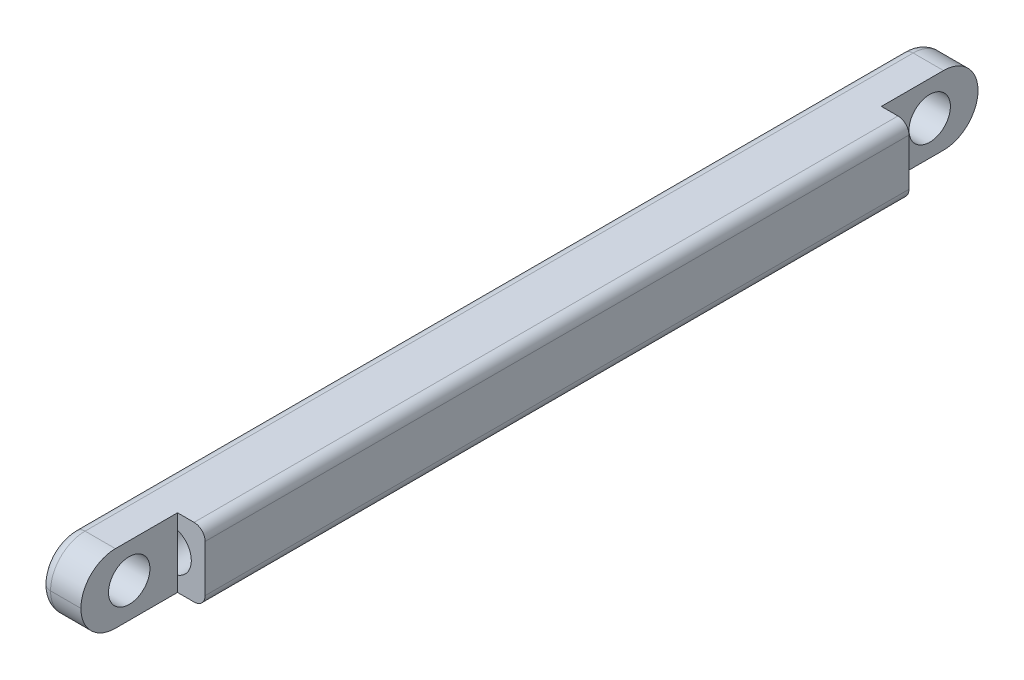
ISO-10303-21;
HEADER;
FILE_DESCRIPTION(('STEP AP214'),'2;1');
FILE_NAME('part.step','',(''),(''),'','','');
FILE_SCHEMA(('AUTOMOTIVE_DESIGN { 1 0 10303 214 1 1 1 1 }'));
ENDSEC;
DATA;
#1=APPLICATION_CONTEXT('core data for automotive mechanical design processes');
#2=APPLICATION_PROTOCOL_DEFINITION('international standard','automotive_design',2000,#1);
#3=PRODUCT_CONTEXT('',#1,'mechanical');
#4=PRODUCT('Part','Part','',(#3));
#5=PRODUCT_RELATED_PRODUCT_CATEGORY('part','',(#4));
#6=PRODUCT_DEFINITION_FORMATION('','',#4);
#7=PRODUCT_DEFINITION_CONTEXT('part definition',#1,'design');
#8=PRODUCT_DEFINITION('design','',#6,#7);
#9=PRODUCT_DEFINITION_SHAPE('','',#8);
#10=(LENGTH_UNIT() NAMED_UNIT(*) SI_UNIT(.MILLI.,.METRE.));
#11=(NAMED_UNIT(*) PLANE_ANGLE_UNIT() SI_UNIT($,.RADIAN.));
#12=(NAMED_UNIT(*) SI_UNIT($,.STERADIAN.) SOLID_ANGLE_UNIT());
#13=UNCERTAINTY_MEASURE_WITH_UNIT(LENGTH_MEASURE(1.E-05),#10,'distance_accuracy_value','');
#14=(GEOMETRIC_REPRESENTATION_CONTEXT(3) GLOBAL_UNCERTAINTY_ASSIGNED_CONTEXT((#13)) GLOBAL_UNIT_ASSIGNED_CONTEXT((#10,
#11,#12)) REPRESENTATION_CONTEXT('',''));
#15=CARTESIAN_POINT('',(0.,0.,0.));
#16=DIRECTION('',(0.,0.,1.));
#17=DIRECTION('',(1.,0.,0.));
#18=AXIS2_PLACEMENT_3D('',#15,#16,#17);
#19=CARTESIAN_POINT('',(0.,0.,0.));
#20=DIRECTION('',(0.,0.,1.));
#21=DIRECTION('',(1.,0.,0.));
#22=AXIS2_PLACEMENT_3D('',#19,#20,#21);
#23=PLANE('',#22);
#24=DIRECTION('',(0.,1.,0.));
#25=VECTOR('',#24,1.);
#26=CARTESIAN_POINT('',(2.5,2.5,0.));
#27=LINE('',#26,#25);
#28=CARTESIAN_POINT('',(2.5,-1.7,0.));
#29=VERTEX_POINT('',#28);
#30=CARTESIAN_POINT('',(2.5,1.7,0.));
#31=VERTEX_POINT('',#30);
#32=EDGE_CURVE('E259',#29,#31,#27,.T.);
#33=ORIENTED_EDGE('',*,*,#32,.F.);
#34=CARTESIAN_POINT('',(1.7,-1.7,0.));
#35=DIRECTION('',(0.,0.,1.));
#36=DIRECTION('',(1.,0.,0.));
#37=AXIS2_PLACEMENT_3D('',#34,#35,#36);
#38=CIRCLE('',#37,0.8);
#39=CARTESIAN_POINT('',(1.7,-2.5,0.));
#40=VERTEX_POINT('',#39);
#41=EDGE_CURVE('E177',#29,#40,#38,.F.);
#42=ORIENTED_EDGE('',*,*,#41,.T.);
#43=DIRECTION('',(1.,0.,0.));
#44=VECTOR('',#43,1.);
#45=CARTESIAN_POINT('',(-2.5,-2.5,0.));
#46=LINE('',#45,#44);
#47=CARTESIAN_POINT('',(0.5,-2.5,0.));
#48=VERTEX_POINT('',#47);
#49=EDGE_CURVE('E162',#48,#40,#46,.T.);
#50=ORIENTED_EDGE('',*,*,#49,.F.);
#51=DIRECTION('',(0.,-1.,0.));
#52=VECTOR('',#51,1.);
#53=CARTESIAN_POINT('',(0.5,2.5,0.));
#54=LINE('',#53,#52);
#55=CARTESIAN_POINT('',(0.5,-1.4142135623731,0.));
#56=VERTEX_POINT('',#55);
#57=EDGE_CURVE('E175',#56,#48,#54,.T.);
#58=ORIENTED_EDGE('',*,*,#57,.F.);
#59=CARTESIAN_POINT('',(0.,0.,0.));
#60=DIRECTION('',(0.,0.,1.));
#61=DIRECTION('',(1.,0.,0.));
#62=AXIS2_PLACEMENT_3D('',#59,#60,#61);
#63=CIRCLE('',#62,1.5);
#64=CARTESIAN_POINT('',(0.5,1.4142135623731,0.));
#65=VERTEX_POINT('',#64);
#66=EDGE_CURVE('E408',#56,#65,#63,.T.);
#67=ORIENTED_EDGE('',*,*,#66,.T.);
#68=CARTESIAN_POINT('',(0.5,2.5,0.));
#69=VERTEX_POINT('',#68);
#70=EDGE_CURVE('E171',#69,#65,#54,.T.);
#71=ORIENTED_EDGE('',*,*,#70,.F.);
#72=DIRECTION('',(-1.,0.,0.));
#73=VECTOR('',#72,1.);
#74=CARTESIAN_POINT('',(-2.5,2.5,0.));
#75=LINE('',#74,#73);
#76=CARTESIAN_POINT('',(1.7,2.5,0.));
#77=VERTEX_POINT('',#76);
#78=EDGE_CURVE('E179',#77,#69,#75,.T.);
#79=ORIENTED_EDGE('',*,*,#78,.F.);
#80=CARTESIAN_POINT('',(1.7,1.7,0.));
#81=DIRECTION('',(0.,0.,1.));
#82=DIRECTION('',(1.,0.,0.));
#83=AXIS2_PLACEMENT_3D('',#80,#81,#82);
#84=CIRCLE('',#83,0.8);
#85=EDGE_CURVE('E391',#77,#31,#84,.F.);
#86=ORIENTED_EDGE('',*,*,#85,.T.);
#87=EDGE_LOOP('',(#33,#42,#50,#58,#67,#71,#79,#86));
#88=FACE_BOUND('',#87,.T.);
#89=ADVANCED_FACE('F37',(#88),#23,.F.);
#90=CARTESIAN_POINT('',(2.5,2.5,51.));
#91=DIRECTION('',(-1.,0.,0.));
#92=DIRECTION('',(0.,0.,1.));
#93=AXIS2_PLACEMENT_3D('',#90,#91,#92);
#94=PLANE('',#93);
#95=DIRECTION('',(0.,1.,0.));
#96=VECTOR('',#95,1.);
#97=CARTESIAN_POINT('',(2.5,2.5,51.));
#98=LINE('',#97,#96);
#99=CARTESIAN_POINT('',(2.5,-1.7,51.));
#100=VERTEX_POINT('',#99);
#101=CARTESIAN_POINT('',(2.5,1.7,51.));
#102=VERTEX_POINT('',#101);
#103=EDGE_CURVE('E178',#100,#102,#98,.T.);
#104=ORIENTED_EDGE('',*,*,#103,.F.);
#105=DIRECTION('',(0.,0.,-1.));
#106=VECTOR('',#105,1.);
#107=CARTESIAN_POINT('',(2.5,-1.7,51.));
#108=LINE('',#107,#106);
#109=EDGE_CURVE('E393',#100,#29,#108,.T.);
#110=ORIENTED_EDGE('',*,*,#109,.T.);
#111=ORIENTED_EDGE('',*,*,#32,.T.);
#112=DIRECTION('',(0.,0.,-1.));
#113=VECTOR('',#112,1.);
#114=CARTESIAN_POINT('',(2.5,1.7,51.));
#115=LINE('',#114,#113);
#116=EDGE_CURVE('E54',#31,#102,#115,.F.);
#117=ORIENTED_EDGE('',*,*,#116,.T.);
#118=EDGE_LOOP('',(#104,#110,#111,#117));
#119=FACE_BOUND('',#118,.T.);
#120=ADVANCED_FACE('F312',(#119),#94,.F.);
#121=CARTESIAN_POINT('',(-2.5,2.5,51.));
#122=DIRECTION('',(0.,-1.,0.));
#123=DIRECTION('',(0.,0.,-1.));
#124=AXIS2_PLACEMENT_3D('',#121,#122,#123);
#125=PLANE('',#124);
#126=DIRECTION('',(1.,0.,0.));
#127=VECTOR('',#126,1.);
#128=CARTESIAN_POINT('',(-2.5,2.5,-4.5));
#129=LINE('',#128,#127);
#130=CARTESIAN_POINT('',(0.5,2.5,-4.5));
#131=VERTEX_POINT('',#130);
#132=CARTESIAN_POINT('',(-1.7,2.5,-4.5));
#133=VERTEX_POINT('',#132);
#134=EDGE_CURVE('E215',#131,#133,#129,.F.);
#135=ORIENTED_EDGE('',*,*,#134,.T.);
#136=DIRECTION('',(0.,0.,-1.));
#137=VECTOR('',#136,1.);
#138=CARTESIAN_POINT('',(-1.7,2.5,51.));
#139=LINE('',#138,#137);
#140=CARTESIAN_POINT('',(-1.7,2.5,55.5));
#141=VERTEX_POINT('',#140);
#142=EDGE_CURVE('E397',#133,#141,#139,.F.);
#143=ORIENTED_EDGE('',*,*,#142,.T.);
#144=DIRECTION('',(-1.,0.,0.));
#145=VECTOR('',#144,1.);
#146=CARTESIAN_POINT('',(-2.5,2.5,55.5));
#147=LINE('',#146,#145);
#148=CARTESIAN_POINT('',(0.5,2.5,55.5));
#149=VERTEX_POINT('',#148);
#150=EDGE_CURVE('E186',#141,#149,#147,.F.);
#151=ORIENTED_EDGE('',*,*,#150,.T.);
#152=DIRECTION('',(0.,0.,-1.));
#153=VECTOR('',#152,1.);
#154=CARTESIAN_POINT('',(0.5,2.5,58.));
#155=LINE('',#154,#153);
#156=CARTESIAN_POINT('',(0.5,2.5,51.));
#157=VERTEX_POINT('',#156);
#158=EDGE_CURVE('E279',#149,#157,#155,.T.);
#159=ORIENTED_EDGE('',*,*,#158,.T.);
#160=DIRECTION('',(-1.,0.,0.));
#161=VECTOR('',#160,1.);
#162=CARTESIAN_POINT('',(-2.5,2.5,51.));
#163=LINE('',#162,#161);
#164=CARTESIAN_POINT('',(1.7,2.5,51.));
#165=VERTEX_POINT('',#164);
#166=EDGE_CURVE('E247',#165,#157,#163,.T.);
#167=ORIENTED_EDGE('',*,*,#166,.F.);
#168=DIRECTION('',(0.,0.,-1.));
#169=VECTOR('',#168,1.);
#170=CARTESIAN_POINT('',(1.7,2.5,51.));
#171=LINE('',#170,#169);
#172=EDGE_CURVE('E246',#165,#77,#171,.T.);
#173=ORIENTED_EDGE('',*,*,#172,.T.);
#174=ORIENTED_EDGE('',*,*,#78,.T.);
#175=DIRECTION('',(0.,0.,1.));
#176=VECTOR('',#175,1.);
#177=CARTESIAN_POINT('',(0.5,2.5,-7.));
#178=LINE('',#177,#176);
#179=EDGE_CURVE('E170',#131,#69,#178,.T.);
#180=ORIENTED_EDGE('',*,*,#179,.F.);
#181=EDGE_LOOP('',(#135,#143,#151,#159,#167,#173,#174,#180));
#182=FACE_BOUND('',#181,.T.);
#183=ADVANCED_FACE('F303',(#182),#125,.F.);
#184=CARTESIAN_POINT('',(-2.5,2.5,51.));
#185=DIRECTION('',(1.,0.,0.));
#186=DIRECTION('',(0.,1.,0.));
#187=AXIS2_PLACEMENT_3D('',#184,#185,#186);
#188=PLANE('',#187);
#189=CARTESIAN_POINT('',(-2.5,0.,55.5));
#190=DIRECTION('',(1.,0.,0.));
#191=DIRECTION('',(0.,1.,0.));
#192=AXIS2_PLACEMENT_3D('',#189,#190,#191);
#193=CIRCLE('',#192,1.7);
#194=CARTESIAN_POINT('',(-2.5,-1.7,55.5));
#195=VERTEX_POINT('',#194);
#196=CARTESIAN_POINT('',(-2.5,0.,57.2));
#197=VERTEX_POINT('',#196);
#198=EDGE_CURVE('E228',#195,#197,#193,.F.);
#199=ORIENTED_EDGE('',*,*,#198,.T.);
#200=CARTESIAN_POINT('',(-2.5,0.,55.5));
#201=DIRECTION('',(1.,0.,0.));
#202=DIRECTION('',(0.,1.,0.));
#203=AXIS2_PLACEMENT_3D('',#200,#201,#202);
#204=CIRCLE('',#203,1.7);
#205=CARTESIAN_POINT('',(-2.5,1.7,55.5));
#206=VERTEX_POINT('',#205);
#207=EDGE_CURVE('E230',#197,#206,#204,.F.);
#208=ORIENTED_EDGE('',*,*,#207,.T.);
#209=DIRECTION('',(0.,0.,-1.));
#210=VECTOR('',#209,1.);
#211=CARTESIAN_POINT('',(-2.5,1.7,51.));
#212=LINE('',#211,#210);
#213=CARTESIAN_POINT('',(-2.5,1.7,-4.5));
#214=VERTEX_POINT('',#213);
#215=EDGE_CURVE('E218',#206,#214,#212,.T.);
#216=ORIENTED_EDGE('',*,*,#215,.T.);
#217=CARTESIAN_POINT('',(-2.5,0.,-4.5));
#218=DIRECTION('',(1.,0.,0.));
#219=DIRECTION('',(0.,1.,0.));
#220=AXIS2_PLACEMENT_3D('',#217,#218,#219);
#221=CIRCLE('',#220,1.7);
#222=CARTESIAN_POINT('',(-2.5,0.,-6.2));
#223=VERTEX_POINT('',#222);
#224=EDGE_CURVE('E222',#214,#223,#221,.F.);
#225=ORIENTED_EDGE('',*,*,#224,.T.);
#226=CARTESIAN_POINT('',(-2.5,0.,-4.5));
#227=DIRECTION('',(1.,0.,0.));
#228=DIRECTION('',(0.,1.,0.));
#229=AXIS2_PLACEMENT_3D('',#226,#227,#228);
#230=CIRCLE('',#229,1.7);
#231=CARTESIAN_POINT('',(-2.5,-1.7,-4.5));
#232=VERTEX_POINT('',#231);
#233=EDGE_CURVE('E224',#223,#232,#230,.F.);
#234=ORIENTED_EDGE('',*,*,#233,.T.);
#235=DIRECTION('',(0.,0.,-1.));
#236=VECTOR('',#235,1.);
#237=CARTESIAN_POINT('',(-2.5,-1.7,51.));
#238=LINE('',#237,#236);
#239=EDGE_CURVE('E226',#232,#195,#238,.F.);
#240=ORIENTED_EDGE('',*,*,#239,.T.);
#241=EDGE_LOOP('',(#199,#208,#216,#225,#234,#240));
#242=FACE_BOUND('',#241,.T.);
#243=CARTESIAN_POINT('',(-2.5,0.,-3.5));
#244=DIRECTION('',(1.,0.,0.));
#245=DIRECTION('',(0.,0.,-1.));
#246=AXIS2_PLACEMENT_3D('',#243,#244,#245);
#247=CIRCLE('',#246,1.5);
#248=CARTESIAN_POINT('',(-2.5,0.,-5.));
#249=VERTEX_POINT('',#248);
#250=EDGE_CURVE('E220',#249,#249,#247,.T.);
#251=ORIENTED_EDGE('',*,*,#250,.T.);
#252=EDGE_LOOP('',(#251));
#253=FACE_BOUND('',#252,.T.);
#254=CARTESIAN_POINT('',(-2.5,0.,54.5));
#255=DIRECTION('',(-1.,0.,0.));
#256=DIRECTION('',(0.,-1.,0.));
#257=AXIS2_PLACEMENT_3D('',#254,#255,#256);
#258=CIRCLE('',#257,1.5);
#259=CARTESIAN_POINT('',(-2.5,-1.5,54.5));
#260=VERTEX_POINT('',#259);
#261=EDGE_CURVE('E204',#260,#260,#258,.T.);
#262=ORIENTED_EDGE('',*,*,#261,.F.);
#263=EDGE_LOOP('',(#262));
#264=FACE_BOUND('',#263,.T.);
#265=ADVANCED_FACE('F301',(#242,#253,#264),#188,.F.);
#266=CARTESIAN_POINT('',(-2.5,-2.5,51.));
#267=DIRECTION('',(0.,1.,0.));
#268=DIRECTION('',(0.,0.,1.));
#269=AXIS2_PLACEMENT_3D('',#266,#267,#268);
#270=PLANE('',#269);
#271=DIRECTION('',(1.,0.,0.));
#272=VECTOR('',#271,1.);
#273=CARTESIAN_POINT('',(-2.5,-2.5,55.5));
#274=LINE('',#273,#272);
#275=CARTESIAN_POINT('',(0.5,-2.5,55.5));
#276=VERTEX_POINT('',#275);
#277=CARTESIAN_POINT('',(-1.7,-2.5,55.5));
#278=VERTEX_POINT('',#277);
#279=EDGE_CURVE('E190',#276,#278,#274,.F.);
#280=ORIENTED_EDGE('',*,*,#279,.T.);
#281=DIRECTION('',(0.,0.,-1.));
#282=VECTOR('',#281,1.);
#283=CARTESIAN_POINT('',(-1.7,-2.5,51.));
#284=LINE('',#283,#282);
#285=CARTESIAN_POINT('',(-1.7,-2.5,-4.5));
#286=VERTEX_POINT('',#285);
#287=EDGE_CURVE('E240',#278,#286,#284,.T.);
#288=ORIENTED_EDGE('',*,*,#287,.T.);
#289=DIRECTION('',(-1.,0.,0.));
#290=VECTOR('',#289,1.);
#291=CARTESIAN_POINT('',(0.5,-2.5,-4.5));
#292=LINE('',#291,#290);
#293=CARTESIAN_POINT('',(0.5,-2.5,-4.5));
#294=VERTEX_POINT('',#293);
#295=EDGE_CURVE('E165',#286,#294,#292,.F.);
#296=ORIENTED_EDGE('',*,*,#295,.T.);
#297=DIRECTION('',(0.,0.,1.));
#298=VECTOR('',#297,1.);
#299=CARTESIAN_POINT('',(0.5,-2.5,-7.));
#300=LINE('',#299,#298);
#301=EDGE_CURVE('E158',#294,#48,#300,.T.);
#302=ORIENTED_EDGE('',*,*,#301,.T.);
#303=ORIENTED_EDGE('',*,*,#49,.T.);
#304=DIRECTION('',(0.,0.,-1.));
#305=VECTOR('',#304,1.);
#306=CARTESIAN_POINT('',(1.7,-2.5,51.));
#307=LINE('',#306,#305);
#308=CARTESIAN_POINT('',(1.7,-2.5,51.));
#309=VERTEX_POINT('',#308);
#310=EDGE_CURVE('E238',#40,#309,#307,.F.);
#311=ORIENTED_EDGE('',*,*,#310,.T.);
#312=DIRECTION('',(1.,0.,0.));
#313=VECTOR('',#312,1.);
#314=CARTESIAN_POINT('',(-2.5,-2.5,51.));
#315=LINE('',#314,#313);
#316=CARTESIAN_POINT('',(0.5,-2.5,51.));
#317=VERTEX_POINT('',#316);
#318=EDGE_CURVE('E250',#317,#309,#315,.T.);
#319=ORIENTED_EDGE('',*,*,#318,.F.);
#320=DIRECTION('',(0.,0.,-1.));
#321=VECTOR('',#320,1.);
#322=CARTESIAN_POINT('',(0.5,-2.5,58.));
#323=LINE('',#322,#321);
#324=EDGE_CURVE('E283',#276,#317,#323,.T.);
#325=ORIENTED_EDGE('',*,*,#324,.F.);
#326=EDGE_LOOP('',(#280,#288,#296,#302,#303,#311,#319,#325));
#327=FACE_BOUND('',#326,.T.);
#328=ADVANCED_FACE('F161',(#327),#270,.F.);
#329=CARTESIAN_POINT('',(0.,0.,51.));
#330=DIRECTION('',(0.,0.,1.));
#331=DIRECTION('',(1.,0.,0.));
#332=AXIS2_PLACEMENT_3D('',#329,#330,#331);
#333=PLANE('',#332);
#334=ORIENTED_EDGE('',*,*,#318,.T.);
#335=CARTESIAN_POINT('',(1.7,-1.7,51.));
#336=DIRECTION('',(0.,0.,1.));
#337=DIRECTION('',(1.,0.,0.));
#338=AXIS2_PLACEMENT_3D('',#335,#336,#337);
#339=CIRCLE('',#338,0.8);
#340=EDGE_CURVE('E11',#309,#100,#339,.T.);
#341=ORIENTED_EDGE('',*,*,#340,.T.);
#342=ORIENTED_EDGE('',*,*,#103,.T.);
#343=CARTESIAN_POINT('',(1.7,1.7,51.));
#344=DIRECTION('',(0.,0.,1.));
#345=DIRECTION('',(1.,0.,0.));
#346=AXIS2_PLACEMENT_3D('',#343,#344,#345);
#347=CIRCLE('',#346,0.8);
#348=EDGE_CURVE('E46',#102,#165,#347,.T.);
#349=ORIENTED_EDGE('',*,*,#348,.T.);
#350=ORIENTED_EDGE('',*,*,#166,.T.);
#351=DIRECTION('',(0.,1.,0.));
#352=VECTOR('',#351,1.);
#353=CARTESIAN_POINT('',(0.5,2.5,51.));
#354=LINE('',#353,#352);
#355=CARTESIAN_POINT('',(0.5,1.4142135623731,51.));
#356=VERTEX_POINT('',#355);
#357=EDGE_CURVE('E262',#356,#157,#354,.T.);
#358=ORIENTED_EDGE('',*,*,#357,.F.);
#359=CARTESIAN_POINT('',(0.,0.,51.));
#360=DIRECTION('',(0.,0.,1.));
#361=DIRECTION('',(1.,0.,0.));
#362=AXIS2_PLACEMENT_3D('',#359,#360,#361);
#363=CIRCLE('',#362,1.5);
#364=CARTESIAN_POINT('',(0.5,-1.4142135623731,51.));
#365=VERTEX_POINT('',#364);
#366=EDGE_CURVE('E285',#365,#356,#363,.T.);
#367=ORIENTED_EDGE('',*,*,#366,.F.);
#368=EDGE_CURVE('E273',#317,#365,#354,.T.);
#369=ORIENTED_EDGE('',*,*,#368,.F.);
#370=EDGE_LOOP('',(#334,#341,#342,#349,#350,#358,#367,#369));
#371=FACE_BOUND('',#370,.T.);
#372=ADVANCED_FACE('F310',(#371),#333,.T.);
#373=CARTESIAN_POINT('',(0.,0.,0.));
#374=DIRECTION('',(0.,0.,1.));
#375=DIRECTION('',(1.,0.,0.));
#376=AXIS2_PLACEMENT_3D('',#373,#374,#375);
#377=CYLINDRICAL_SURFACE('',#376,1.5);
#378=EDGE_CURVE('E275',#65,#56,#63,.T.);
#379=ORIENTED_EDGE('',*,*,#378,.F.);
#380=ORIENTED_EDGE('',*,*,#66,.F.);
#381=EDGE_LOOP('',(#379,#380));
#382=FACE_BOUND('',#381,.T.);
#383=EDGE_CURVE('E410',#356,#365,#363,.T.);
#384=ORIENTED_EDGE('',*,*,#383,.T.);
#385=ORIENTED_EDGE('',*,*,#366,.T.);
#386=EDGE_LOOP('',(#384,#385));
#387=FACE_BOUND('',#386,.T.);
#388=ADVANCED_FACE('F325',(#382,#387),#377,.F.);
#389=CARTESIAN_POINT('',(0.,0.,51.));
#390=DIRECTION('',(0.,0.,-1.));
#391=DIRECTION('',(-1.,0.,0.));
#392=AXIS2_PLACEMENT_3D('',#389,#390,#391);
#393=PLANE('',#392);
#394=ORIENTED_EDGE('',*,*,#383,.F.);
#395=EDGE_CURVE('E269',#365,#356,#354,.T.);
#396=ORIENTED_EDGE('',*,*,#395,.F.);
#397=EDGE_LOOP('',(#394,#396));
#398=FACE_BOUND('',#397,.T.);
#399=ADVANCED_FACE('F328',(#398),#393,.T.);
#400=CARTESIAN_POINT('',(0.5,2.5,58.));
#401=DIRECTION('',(-1.,0.,0.));
#402=DIRECTION('',(0.,0.,1.));
#403=AXIS2_PLACEMENT_3D('',#400,#401,#402);
#404=PLANE('',#403);
#405=CARTESIAN_POINT('',(0.5,0.,54.5));
#406=DIRECTION('',(-1.,0.,0.));
#407=DIRECTION('',(0.,0.,1.));
#408=AXIS2_PLACEMENT_3D('',#405,#406,#407);
#409=CIRCLE('',#408,1.5);
#410=CARTESIAN_POINT('',(0.5,0.,56.));
#411=VERTEX_POINT('',#410);
#412=EDGE_CURVE('E291',#411,#411,#409,.T.);
#413=ORIENTED_EDGE('',*,*,#412,.T.);
#414=EDGE_LOOP('',(#413));
#415=FACE_BOUND('',#414,.T.);
#416=CARTESIAN_POINT('',(0.5,0.,55.5));
#417=DIRECTION('',(-1.,0.,0.));
#418=DIRECTION('',(0.,0.,1.));
#419=AXIS2_PLACEMENT_3D('',#416,#417,#418);
#420=CIRCLE('',#419,2.5);
#421=CARTESIAN_POINT('',(0.5,0.,58.));
#422=VERTEX_POINT('',#421);
#423=EDGE_CURVE('E266',#149,#422,#420,.F.);
#424=ORIENTED_EDGE('',*,*,#423,.T.);
#425=CARTESIAN_POINT('',(0.5,0.,55.5));
#426=DIRECTION('',(-1.,0.,0.));
#427=DIRECTION('',(0.,0.,1.));
#428=AXIS2_PLACEMENT_3D('',#425,#426,#427);
#429=CIRCLE('',#428,2.5);
#430=EDGE_CURVE('E287',#422,#276,#429,.F.);
#431=ORIENTED_EDGE('',*,*,#430,.T.);
#432=ORIENTED_EDGE('',*,*,#324,.T.);
#433=ORIENTED_EDGE('',*,*,#368,.T.);
#434=ORIENTED_EDGE('',*,*,#395,.T.);
#435=ORIENTED_EDGE('',*,*,#357,.T.);
#436=ORIENTED_EDGE('',*,*,#158,.F.);
#437=EDGE_LOOP('',(#424,#431,#432,#433,#434,#435,#436));
#438=FACE_BOUND('',#437,.T.);
#439=ADVANCED_FACE('F330',(#415,#438),#404,.F.);
#440=CARTESIAN_POINT('',(0.,0.,55.5));
#441=DIRECTION('',(-1.,0.,0.));
#442=DIRECTION('',(0.,0.,1.));
#443=AXIS2_PLACEMENT_3D('',#440,#441,#442);
#444=CYLINDRICAL_SURFACE('',#443,2.5);
#445=ORIENTED_EDGE('',*,*,#150,.F.);
#446=CARTESIAN_POINT('',(-1.7,0.,55.5));
#447=DIRECTION('',(1.,0.,0.));
#448=DIRECTION('',(0.,1.,0.));
#449=AXIS2_PLACEMENT_3D('',#446,#447,#448);
#450=CIRCLE('',#449,2.5);
#451=CARTESIAN_POINT('',(-1.7,0.,58.));
#452=VERTEX_POINT('',#451);
#453=EDGE_CURVE('E233',#141,#452,#450,.T.);
#454=ORIENTED_EDGE('',*,*,#453,.T.);
#455=DIRECTION('',(-1.,0.,0.));
#456=VECTOR('',#455,1.);
#457=CARTESIAN_POINT('',(0.,0.,58.));
#458=LINE('',#457,#456);
#459=EDGE_CURVE('E274',#422,#452,#458,.T.);
#460=ORIENTED_EDGE('',*,*,#459,.F.);
#461=ORIENTED_EDGE('',*,*,#423,.F.);
#462=EDGE_LOOP('',(#445,#454,#460,#461));
#463=FACE_BOUND('',#462,.T.);
#464=ADVANCED_FACE('F333',(#463),#444,.T.);
#465=CARTESIAN_POINT('',(0.,0.,55.5));
#466=DIRECTION('',(1.,0.,0.));
#467=DIRECTION('',(0.,0.,-1.));
#468=AXIS2_PLACEMENT_3D('',#465,#466,#467);
#469=CYLINDRICAL_SURFACE('',#468,2.5);
#470=ORIENTED_EDGE('',*,*,#459,.T.);
#471=CARTESIAN_POINT('',(-1.7,0.,55.5));
#472=DIRECTION('',(1.,0.,0.));
#473=DIRECTION('',(0.,1.,0.));
#474=AXIS2_PLACEMENT_3D('',#471,#472,#473);
#475=CIRCLE('',#474,2.5);
#476=EDGE_CURVE('E236',#452,#278,#475,.T.);
#477=ORIENTED_EDGE('',*,*,#476,.T.);
#478=ORIENTED_EDGE('',*,*,#279,.F.);
#479=ORIENTED_EDGE('',*,*,#430,.F.);
#480=EDGE_LOOP('',(#470,#477,#478,#479));
#481=FACE_BOUND('',#480,.T.);
#482=ADVANCED_FACE('F340',(#481),#469,.T.);
#483=CARTESIAN_POINT('',(2.500025,0.,54.5));
#484=DIRECTION('',(-1.,0.,0.));
#485=DIRECTION('',(0.,-1.,0.));
#486=AXIS2_PLACEMENT_3D('',#483,#484,#485);
#487=CYLINDRICAL_SURFACE('',#486,1.5);
#488=ORIENTED_EDGE('',*,*,#261,.T.);
#489=EDGE_LOOP('',(#488));
#490=FACE_BOUND('',#489,.T.);
#491=ORIENTED_EDGE('',*,*,#412,.F.);
#492=EDGE_LOOP('',(#491));
#493=FACE_BOUND('',#492,.T.);
#494=ADVANCED_FACE('F298',(#490,#493),#487,.F.);
#495=CARTESIAN_POINT('',(0.,0.,0.));
#496=DIRECTION('',(0.,0.,-1.));
#497=DIRECTION('',(-1.,0.,0.));
#498=AXIS2_PLACEMENT_3D('',#495,#496,#497);
#499=PLANE('',#498);
#500=EDGE_CURVE('E185',#65,#56,#54,.T.);
#501=ORIENTED_EDGE('',*,*,#500,.F.);
#502=ORIENTED_EDGE('',*,*,#378,.T.);
#503=EDGE_LOOP('',(#501,#502));
#504=FACE_BOUND('',#503,.T.);
#505=ADVANCED_FACE('F339',(#504),#499,.F.);
#506=CARTESIAN_POINT('',(0.5,2.5,-7.));
#507=DIRECTION('',(-1.,0.,0.));
#508=DIRECTION('',(0.,0.,1.));
#509=AXIS2_PLACEMENT_3D('',#506,#507,#508);
#510=PLANE('',#509);
#511=CARTESIAN_POINT('',(0.5,0.,-3.5));
#512=DIRECTION('',(1.,0.,0.));
#513=DIRECTION('',(0.,0.,-1.));
#514=AXIS2_PLACEMENT_3D('',#511,#512,#513);
#515=CIRCLE('',#514,1.5);
#516=CARTESIAN_POINT('',(0.5,0.,-5.));
#517=VERTEX_POINT('',#516);
#518=EDGE_CURVE('E202',#517,#517,#515,.T.);
#519=ORIENTED_EDGE('',*,*,#518,.F.);
#520=EDGE_LOOP('',(#519));
#521=FACE_BOUND('',#520,.T.);
#522=ORIENTED_EDGE('',*,*,#301,.F.);
#523=CARTESIAN_POINT('',(0.5,0.,-4.5));
#524=DIRECTION('',(-1.,0.,0.));
#525=DIRECTION('',(0.,0.,1.));
#526=AXIS2_PLACEMENT_3D('',#523,#524,#525);
#527=CIRCLE('',#526,2.5);
#528=CARTESIAN_POINT('',(0.5,0.,-7.));
#529=VERTEX_POINT('',#528);
#530=EDGE_CURVE('E213',#294,#529,#527,.F.);
#531=ORIENTED_EDGE('',*,*,#530,.T.);
#532=CARTESIAN_POINT('',(0.5,0.,-4.5));
#533=DIRECTION('',(-1.,0.,0.));
#534=DIRECTION('',(0.,0.,1.));
#535=AXIS2_PLACEMENT_3D('',#532,#533,#534);
#536=CIRCLE('',#535,2.5);
#537=EDGE_CURVE('E188',#529,#131,#536,.F.);
#538=ORIENTED_EDGE('',*,*,#537,.T.);
#539=ORIENTED_EDGE('',*,*,#179,.T.);
#540=ORIENTED_EDGE('',*,*,#70,.T.);
#541=ORIENTED_EDGE('',*,*,#500,.T.);
#542=ORIENTED_EDGE('',*,*,#57,.T.);
#543=EDGE_LOOP('',(#522,#531,#538,#539,#540,#541,#542));
#544=FACE_BOUND('',#543,.T.);
#545=ADVANCED_FACE('F182',(#521,#544),#510,.F.);
#546=CARTESIAN_POINT('',(0.,0.,-4.5));
#547=DIRECTION('',(-1.,0.,0.));
#548=DIRECTION('',(0.,0.,1.));
#549=AXIS2_PLACEMENT_3D('',#546,#547,#548);
#550=CYLINDRICAL_SURFACE('',#549,2.5);
#551=DIRECTION('',(1.,0.,0.));
#552=VECTOR('',#551,1.);
#553=CARTESIAN_POINT('',(0.5,0.,-7.));
#554=LINE('',#553,#552);
#555=CARTESIAN_POINT('',(-1.7,0.,-7.));
#556=VERTEX_POINT('',#555);
#557=EDGE_CURVE('E201',#556,#529,#554,.T.);
#558=ORIENTED_EDGE('',*,*,#557,.F.);
#559=CARTESIAN_POINT('',(-1.7,0.,-4.5));
#560=DIRECTION('',(1.,0.,0.));
#561=DIRECTION('',(0.,1.,0.));
#562=AXIS2_PLACEMENT_3D('',#559,#560,#561);
#563=CIRCLE('',#562,2.5);
#564=EDGE_CURVE('E244',#556,#133,#563,.T.);
#565=ORIENTED_EDGE('',*,*,#564,.T.);
#566=ORIENTED_EDGE('',*,*,#134,.F.);
#567=ORIENTED_EDGE('',*,*,#537,.F.);
#568=EDGE_LOOP('',(#558,#565,#566,#567));
#569=FACE_BOUND('',#568,.T.);
#570=ADVANCED_FACE('F343',(#569),#550,.T.);
#571=CARTESIAN_POINT('',(0.,0.,-4.5));
#572=DIRECTION('',(1.,0.,0.));
#573=DIRECTION('',(0.,0.,-1.));
#574=AXIS2_PLACEMENT_3D('',#571,#572,#573);
#575=CYLINDRICAL_SURFACE('',#574,2.5);
#576=ORIENTED_EDGE('',*,*,#295,.F.);
#577=CARTESIAN_POINT('',(-1.7,0.,-4.5));
#578=DIRECTION('',(1.,0.,0.));
#579=DIRECTION('',(0.,1.,0.));
#580=AXIS2_PLACEMENT_3D('',#577,#578,#579);
#581=CIRCLE('',#580,2.5);
#582=EDGE_CURVE('E242',#286,#556,#581,.T.);
#583=ORIENTED_EDGE('',*,*,#582,.T.);
#584=ORIENTED_EDGE('',*,*,#557,.T.);
#585=ORIENTED_EDGE('',*,*,#530,.F.);
#586=EDGE_LOOP('',(#576,#583,#584,#585));
#587=FACE_BOUND('',#586,.T.);
#588=ADVANCED_FACE('F351',(#587),#575,.T.);
#589=CARTESIAN_POINT('',(-2.5,0.,-3.5));
#590=DIRECTION('',(1.,0.,0.));
#591=DIRECTION('',(0.,0.,-1.));
#592=AXIS2_PLACEMENT_3D('',#589,#590,#591);
#593=CYLINDRICAL_SURFACE('',#592,1.5);
#594=ORIENTED_EDGE('',*,*,#250,.F.);
#595=EDGE_LOOP('',(#594));
#596=FACE_BOUND('',#595,.T.);
#597=ORIENTED_EDGE('',*,*,#518,.T.);
#598=EDGE_LOOP('',(#597));
#599=FACE_BOUND('',#598,.T.);
#600=ADVANCED_FACE('F348',(#596,#599),#593,.F.);
#601=CARTESIAN_POINT('',(-1.7,0.,-4.5));
#602=DIRECTION('',(1.,0.,0.));
#603=DIRECTION('',(0.,1.,0.));
#604=AXIS2_PLACEMENT_3D('',#601,#602,#603);
#605=TOROIDAL_SURFACE('',#604,1.7,0.8);
#606=CARTESIAN_POINT('',(-1.7,0.,-6.2));
#607=DIRECTION('',(0.,1.,0.));
#608=DIRECTION('',(-1.,0.,0.));
#609=AXIS2_PLACEMENT_3D('',#606,#607,#608);
#610=CIRCLE('',#609,0.8);
#611=EDGE_CURVE('E368',#556,#223,#610,.T.);
#612=ORIENTED_EDGE('',*,*,#611,.F.);
#613=ORIENTED_EDGE('',*,*,#582,.F.);
#614=CARTESIAN_POINT('',(-1.7,-1.7,-4.5));
#615=DIRECTION('',(0.,0.,1.));
#616=DIRECTION('',(1.,0.,0.));
#617=AXIS2_PLACEMENT_3D('',#614,#615,#616);
#618=CIRCLE('',#617,0.8);
#619=EDGE_CURVE('E41',#232,#286,#618,.T.);
#620=ORIENTED_EDGE('',*,*,#619,.F.);
#621=ORIENTED_EDGE('',*,*,#233,.F.);
#622=EDGE_LOOP('',(#612,#613,#620,#621));
#623=FACE_BOUND('',#622,.T.);
#624=ADVANCED_FACE('F350',(#623),#605,.T.);
#625=CARTESIAN_POINT('',(-1.7,-1.7,51.));
#626=DIRECTION('',(0.,0.,-1.));
#627=DIRECTION('',(-1.,0.,0.));
#628=AXIS2_PLACEMENT_3D('',#625,#626,#627);
#629=CYLINDRICAL_SURFACE('',#628,0.8);
#630=ORIENTED_EDGE('',*,*,#619,.T.);
#631=ORIENTED_EDGE('',*,*,#287,.F.);
#632=CARTESIAN_POINT('',(-1.7,-1.7,55.5));
#633=DIRECTION('',(0.,0.,1.));
#634=DIRECTION('',(1.,0.,0.));
#635=AXIS2_PLACEMENT_3D('',#632,#633,#634);
#636=CIRCLE('',#635,0.8);
#637=EDGE_CURVE('E374',#195,#278,#636,.T.);
#638=ORIENTED_EDGE('',*,*,#637,.F.);
#639=ORIENTED_EDGE('',*,*,#239,.F.);
#640=EDGE_LOOP('',(#630,#631,#638,#639));
#641=FACE_BOUND('',#640,.T.);
#642=ADVANCED_FACE('F357',(#641),#629,.T.);
#643=CARTESIAN_POINT('',(-1.7,0.,-4.5));
#644=DIRECTION('',(1.,0.,0.));
#645=DIRECTION('',(0.,1.,0.));
#646=AXIS2_PLACEMENT_3D('',#643,#644,#645);
#647=TOROIDAL_SURFACE('',#646,1.7,0.8);
#648=ORIENTED_EDGE('',*,*,#611,.T.);
#649=ORIENTED_EDGE('',*,*,#224,.F.);
#650=CARTESIAN_POINT('',(-1.7,1.7,-4.5));
#651=DIRECTION('',(0.,0.,1.));
#652=DIRECTION('',(1.,0.,0.));
#653=AXIS2_PLACEMENT_3D('',#650,#651,#652);
#654=CIRCLE('',#653,0.8);
#655=EDGE_CURVE('E380',#133,#214,#654,.T.);
#656=ORIENTED_EDGE('',*,*,#655,.F.);
#657=ORIENTED_EDGE('',*,*,#564,.F.);
#658=EDGE_LOOP('',(#648,#649,#656,#657));
#659=FACE_BOUND('',#658,.T.);
#660=ADVANCED_FACE('F439',(#659),#647,.T.);
#661=CARTESIAN_POINT('',(-1.7,0.,55.5));
#662=DIRECTION('',(1.,0.,0.));
#663=DIRECTION('',(0.,1.,0.));
#664=AXIS2_PLACEMENT_3D('',#661,#662,#663);
#665=TOROIDAL_SURFACE('',#664,1.7,0.8);
#666=ORIENTED_EDGE('',*,*,#637,.T.);
#667=ORIENTED_EDGE('',*,*,#476,.F.);
#668=CARTESIAN_POINT('',(-1.7,0.,57.2));
#669=DIRECTION('',(0.,1.,0.));
#670=DIRECTION('',(-1.,0.,0.));
#671=AXIS2_PLACEMENT_3D('',#668,#669,#670);
#672=CIRCLE('',#671,0.8);
#673=EDGE_CURVE('E385',#197,#452,#672,.T.);
#674=ORIENTED_EDGE('',*,*,#673,.F.);
#675=ORIENTED_EDGE('',*,*,#198,.F.);
#676=EDGE_LOOP('',(#666,#667,#674,#675));
#677=FACE_BOUND('',#676,.T.);
#678=ADVANCED_FACE('F442',(#677),#665,.T.);
#679=CARTESIAN_POINT('',(-1.7,1.7,51.));
#680=DIRECTION('',(0.,0.,-1.));
#681=DIRECTION('',(-1.,0.,0.));
#682=AXIS2_PLACEMENT_3D('',#679,#680,#681);
#683=CYLINDRICAL_SURFACE('',#682,0.8);
#684=ORIENTED_EDGE('',*,*,#655,.T.);
#685=ORIENTED_EDGE('',*,*,#215,.F.);
#686=CARTESIAN_POINT('',(-1.7,1.7,55.5));
#687=DIRECTION('',(0.,0.,1.));
#688=DIRECTION('',(1.,0.,0.));
#689=AXIS2_PLACEMENT_3D('',#686,#687,#688);
#690=CIRCLE('',#689,0.8);
#691=EDGE_CURVE('E387',#141,#206,#690,.T.);
#692=ORIENTED_EDGE('',*,*,#691,.F.);
#693=ORIENTED_EDGE('',*,*,#142,.F.);
#694=EDGE_LOOP('',(#684,#685,#692,#693));
#695=FACE_BOUND('',#694,.T.);
#696=ADVANCED_FACE('F433',(#695),#683,.T.);
#697=CARTESIAN_POINT('',(-1.7,0.,55.5));
#698=DIRECTION('',(1.,0.,0.));
#699=DIRECTION('',(0.,1.,0.));
#700=AXIS2_PLACEMENT_3D('',#697,#698,#699);
#701=TOROIDAL_SURFACE('',#700,1.7,0.8);
#702=ORIENTED_EDGE('',*,*,#673,.T.);
#703=ORIENTED_EDGE('',*,*,#453,.F.);
#704=ORIENTED_EDGE('',*,*,#691,.T.);
#705=ORIENTED_EDGE('',*,*,#207,.F.);
#706=EDGE_LOOP('',(#702,#703,#704,#705));
#707=FACE_BOUND('',#706,.T.);
#708=ADVANCED_FACE('F429',(#707),#701,.T.);
#709=CARTESIAN_POINT('',(1.7,-1.7,51.));
#710=DIRECTION('',(0.,0.,-1.));
#711=DIRECTION('',(-1.,0.,0.));
#712=AXIS2_PLACEMENT_3D('',#709,#710,#711);
#713=CYLINDRICAL_SURFACE('',#712,0.8);
#714=ORIENTED_EDGE('',*,*,#340,.F.);
#715=ORIENTED_EDGE('',*,*,#310,.F.);
#716=ORIENTED_EDGE('',*,*,#41,.F.);
#717=ORIENTED_EDGE('',*,*,#109,.F.);
#718=EDGE_LOOP('',(#714,#715,#716,#717));
#719=FACE_BOUND('',#718,.T.);
#720=ADVANCED_FACE('F423',(#719),#713,.T.);
#721=CARTESIAN_POINT('',(1.7,1.7,51.));
#722=DIRECTION('',(0.,0.,-1.));
#723=DIRECTION('',(-1.,0.,0.));
#724=AXIS2_PLACEMENT_3D('',#721,#722,#723);
#725=CYLINDRICAL_SURFACE('',#724,0.8);
#726=ORIENTED_EDGE('',*,*,#348,.F.);
#727=ORIENTED_EDGE('',*,*,#116,.F.);
#728=ORIENTED_EDGE('',*,*,#85,.F.);
#729=ORIENTED_EDGE('',*,*,#172,.F.);
#730=EDGE_LOOP('',(#726,#727,#728,#729));
#731=FACE_BOUND('',#730,.T.);
#732=ADVANCED_FACE('F39',(#731),#725,.T.);
#733=CLOSED_SHELL('',(#89,#120,#183,#265,#328,#372,#388,#399,#439,#464,#482,#494,#505,#545,#570,
#588,#600,#624,#642,#660,#678,#696,#708,#720,#732));
#734=MANIFOLD_SOLID_BREP('B2',#733);
#735=ADVANCED_BREP_SHAPE_REPRESENTATION('',(#18,#734),#14);
#736=SHAPE_DEFINITION_REPRESENTATION(#9,#735);
ENDSEC;
END-ISO-10303-21;
